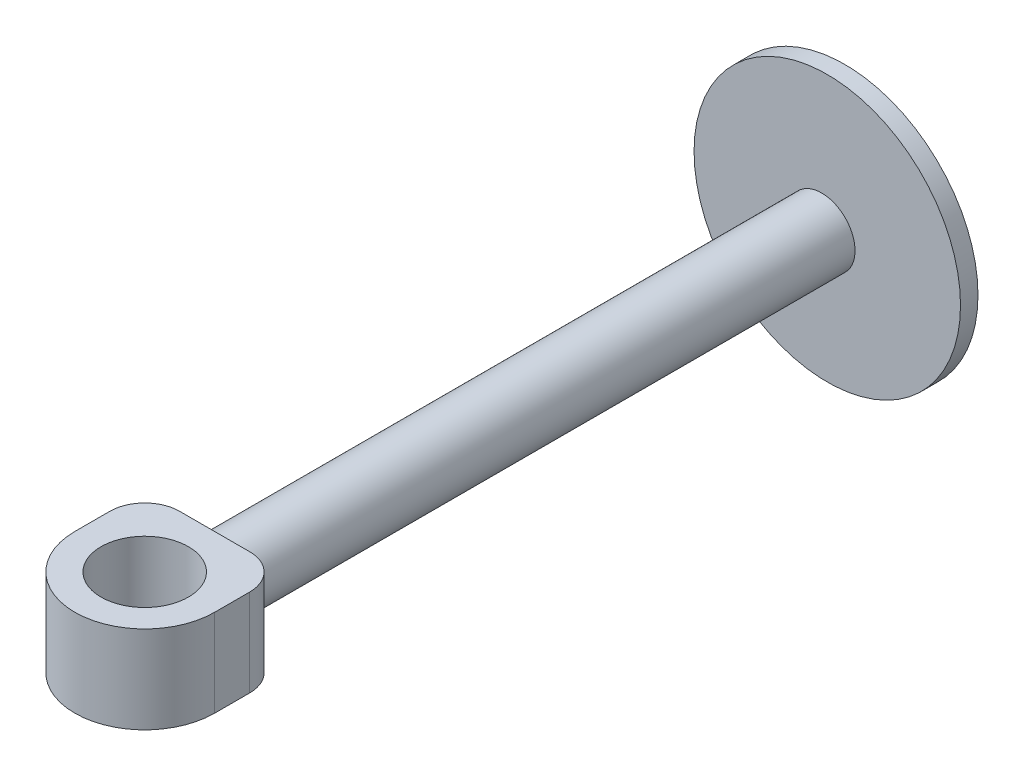
ISO-10303-21;
HEADER;
FILE_DESCRIPTION(('STEP AP214'),'2;1');
FILE_NAME('part.step','',(''),(''),'','','');
FILE_SCHEMA(('AUTOMOTIVE_DESIGN { 1 0 10303 214 1 1 1 1 }'));
ENDSEC;
DATA;
#1=APPLICATION_CONTEXT('core data for automotive mechanical design processes');
#2=APPLICATION_PROTOCOL_DEFINITION('international standard','automotive_design',2000,#1);
#3=PRODUCT_CONTEXT('',#1,'mechanical');
#4=PRODUCT('Part','Part','',(#3));
#5=PRODUCT_RELATED_PRODUCT_CATEGORY('part','',(#4));
#6=PRODUCT_DEFINITION_FORMATION('','',#4);
#7=PRODUCT_DEFINITION_CONTEXT('part definition',#1,'design');
#8=PRODUCT_DEFINITION('design','',#6,#7);
#9=PRODUCT_DEFINITION_SHAPE('','',#8);
#10=(LENGTH_UNIT() NAMED_UNIT(*) SI_UNIT(.MILLI.,.METRE.));
#11=(NAMED_UNIT(*) PLANE_ANGLE_UNIT() SI_UNIT($,.RADIAN.));
#12=(NAMED_UNIT(*) SI_UNIT($,.STERADIAN.) SOLID_ANGLE_UNIT());
#13=UNCERTAINTY_MEASURE_WITH_UNIT(LENGTH_MEASURE(1.E-05),#10,'distance_accuracy_value','');
#14=(GEOMETRIC_REPRESENTATION_CONTEXT(3) GLOBAL_UNCERTAINTY_ASSIGNED_CONTEXT((#13)) GLOBAL_UNIT_ASSIGNED_CONTEXT((#10,
#11,#12)) REPRESENTATION_CONTEXT('',''));
#15=CARTESIAN_POINT('',(0.,0.,0.));
#16=DIRECTION('',(0.,0.,1.));
#17=DIRECTION('',(1.,0.,0.));
#18=AXIS2_PLACEMENT_3D('',#15,#16,#17);
#19=CARTESIAN_POINT('',(0.,0.,-158.1766));
#20=DIRECTION('',(0.,0.,1.));
#21=DIRECTION('',(1.,0.,0.));
#22=AXIS2_PLACEMENT_3D('',#19,#20,#21);
#23=CYLINDRICAL_SURFACE('',#22,38.1);
#24=CARTESIAN_POINT('',(0.,0.,-158.1766));
#25=DIRECTION('',(0.,0.,1.));
#26=DIRECTION('',(-1.,0.,0.));
#27=AXIS2_PLACEMENT_3D('',#24,#25,#26);
#28=CIRCLE('',#27,38.1);
#29=CARTESIAN_POINT('',(-38.1,0.,-158.1766));
#30=VERTEX_POINT('',#29);
#31=EDGE_CURVE('E11',#30,#30,#28,.T.);
#32=ORIENTED_EDGE('',*,*,#31,.T.);
#33=EDGE_LOOP('',(#32));
#34=FACE_BOUND('',#33,.T.);
#35=CARTESIAN_POINT('',(0.,0.,-153.1766));
#36=DIRECTION('',(0.,0.,1.));
#37=DIRECTION('',(-1.,0.,0.));
#38=AXIS2_PLACEMENT_3D('',#35,#36,#37);
#39=CIRCLE('',#38,38.1);
#40=CARTESIAN_POINT('',(-38.1,0.,-153.1766));
#41=VERTEX_POINT('',#40);
#42=EDGE_CURVE('E50',#41,#41,#39,.T.);
#43=ORIENTED_EDGE('',*,*,#42,.F.);
#44=EDGE_LOOP('',(#43));
#45=FACE_BOUND('',#44,.T.);
#46=ADVANCED_FACE('F47',(#34,#45),#23,.T.);
#47=CARTESIAN_POINT('',(0.,0.,-158.1766));
#48=DIRECTION('',(0.,0.,-1.));
#49=DIRECTION('',(-1.,0.,0.));
#50=AXIS2_PLACEMENT_3D('',#47,#48,#49);
#51=PLANE('',#50);
#52=ORIENTED_EDGE('',*,*,#31,.F.);
#53=EDGE_LOOP('',(#52));
#54=FACE_BOUND('',#53,.T.);
#55=ADVANCED_FACE('F62',(#54),#51,.T.);
#56=CARTESIAN_POINT('',(0.,0.,-153.1766));
#57=DIRECTION('',(0.,0.,-1.));
#58=DIRECTION('',(-1.,0.,0.));
#59=AXIS2_PLACEMENT_3D('',#56,#57,#58);
#60=PLANE('',#59);
#61=ORIENTED_EDGE('',*,*,#42,.T.);
#62=EDGE_LOOP('',(#61));
#63=FACE_BOUND('',#62,.T.);
#64=ADVANCED_FACE('F59',(#63),#60,.F.);
#65=CLOSED_SHELL('',(#46,#55,#64));
#66=MANIFOLD_SOLID_BREP('B2',#65);
#67=CARTESIAN_POINT('',(0.,-12.5,42.0218));
#68=DIRECTION('',(0.,-1.,0.));
#69=DIRECTION('',(0.,0.,-1.));
#70=AXIS2_PLACEMENT_3D('',#67,#68,#69);
#71=CYLINDRICAL_SURFACE('',#70,20.);
#72=DIRECTION('',(0.,-1.,0.));
#73=VECTOR('',#72,1.);
#74=CARTESIAN_POINT('',(-20.,-12.5,42.0218));
#75=LINE('',#74,#73);
#76=CARTESIAN_POINT('',(-20.,-12.5,42.0218));
#77=VERTEX_POINT('',#76);
#78=CARTESIAN_POINT('',(-20.,12.5,42.0218));
#79=VERTEX_POINT('',#78);
#80=EDGE_CURVE('E157',#77,#79,#75,.F.);
#81=ORIENTED_EDGE('',*,*,#80,.F.);
#82=CARTESIAN_POINT('',(0.,-12.5,42.0218));
#83=DIRECTION('',(0.,1.,0.));
#84=DIRECTION('',(0.,0.,1.));
#85=AXIS2_PLACEMENT_3D('',#82,#83,#84);
#86=CIRCLE('',#85,20.);
#87=CARTESIAN_POINT('',(20.,-12.5,42.0218));
#88=VERTEX_POINT('',#87);
#89=EDGE_CURVE('E143',#88,#77,#86,.F.);
#90=ORIENTED_EDGE('',*,*,#89,.F.);
#91=DIRECTION('',(0.,-1.,0.));
#92=VECTOR('',#91,1.);
#93=CARTESIAN_POINT('',(20.,-12.5,42.0218));
#94=LINE('',#93,#92);
#95=CARTESIAN_POINT('',(20.,12.5,42.0218));
#96=VERTEX_POINT('',#95);
#97=EDGE_CURVE('E154',#96,#88,#94,.T.);
#98=ORIENTED_EDGE('',*,*,#97,.F.);
#99=CARTESIAN_POINT('',(0.,12.5,42.0218));
#100=DIRECTION('',(0.,-1.,0.));
#101=DIRECTION('',(0.,0.,-1.));
#102=AXIS2_PLACEMENT_3D('',#99,#100,#101);
#103=CIRCLE('',#102,20.);
#104=EDGE_CURVE('E153',#79,#96,#103,.F.);
#105=ORIENTED_EDGE('',*,*,#104,.F.);
#106=EDGE_LOOP('',(#81,#90,#98,#105));
#107=FACE_BOUND('',#106,.T.);
#108=ADVANCED_FACE('F88',(#107),#71,.T.);
#109=CARTESIAN_POINT('',(0.,0.,22.0218));
#110=DIRECTION('',(0.,0.,-1.));
#111=DIRECTION('',(-1.,0.,0.));
#112=AXIS2_PLACEMENT_3D('',#109,#110,#111);
#113=PLANE('',#112);
#114=DIRECTION('',(-1.,0.,0.));
#115=VECTOR('',#114,1.);
#116=CARTESIAN_POINT('',(-20.,12.5,22.0218));
#117=LINE('',#116,#115);
#118=CARTESIAN_POINT('',(10.,12.5,22.0218));
#119=VERTEX_POINT('',#118);
#120=CARTESIAN_POINT('',(-10.,12.5,22.0218));
#121=VERTEX_POINT('',#120);
#122=EDGE_CURVE('E201',#119,#121,#117,.T.);
#123=ORIENTED_EDGE('',*,*,#122,.F.);
#124=DIRECTION('',(0.,1.,0.));
#125=VECTOR('',#124,1.);
#126=CARTESIAN_POINT('',(10.,-12.5,22.0218));
#127=LINE('',#126,#125);
#128=CARTESIAN_POINT('',(10.,-12.5,22.0218));
#129=VERTEX_POINT('',#128);
#130=EDGE_CURVE('E110',#119,#129,#127,.F.);
#131=ORIENTED_EDGE('',*,*,#130,.T.);
#132=DIRECTION('',(1.,0.,0.));
#133=VECTOR('',#132,1.);
#134=CARTESIAN_POINT('',(-20.,-12.5,22.0218));
#135=LINE('',#134,#133);
#136=CARTESIAN_POINT('',(-10.,-12.5,22.0218));
#137=VERTEX_POINT('',#136);
#138=EDGE_CURVE('E168',#137,#129,#135,.T.);
#139=ORIENTED_EDGE('',*,*,#138,.F.);
#140=DIRECTION('',(0.,-1.,0.));
#141=VECTOR('',#140,1.);
#142=CARTESIAN_POINT('',(-10.,12.5,22.0218));
#143=LINE('',#142,#141);
#144=EDGE_CURVE('E188',#137,#121,#143,.F.);
#145=ORIENTED_EDGE('',*,*,#144,.T.);
#146=EDGE_LOOP('',(#123,#131,#139,#145));
#147=FACE_BOUND('',#146,.T.);
#148=CARTESIAN_POINT('',(0.,0.,22.0218));
#149=DIRECTION('',(0.,0.,-1.));
#150=DIRECTION('',(-1.,0.,0.));
#151=AXIS2_PLACEMENT_3D('',#148,#149,#150);
#152=CIRCLE('',#151,9.525);
#153=CARTESIAN_POINT('',(-9.525,0.,22.0218));
#154=VERTEX_POINT('',#153);
#155=EDGE_CURVE('E174',#154,#154,#152,.T.);
#156=ORIENTED_EDGE('',*,*,#155,.F.);
#157=EDGE_LOOP('',(#156));
#158=FACE_BOUND('',#157,.T.);
#159=ADVANCED_FACE('F203',(#147,#158),#113,.T.);
#160=CARTESIAN_POINT('',(20.,-12.5,62.0218));
#161=DIRECTION('',(-1.,0.,0.));
#162=DIRECTION('',(0.,0.,1.));
#163=AXIS2_PLACEMENT_3D('',#160,#161,#162);
#164=PLANE('',#163);
#165=DIRECTION('',(0.,0.,-1.));
#166=VECTOR('',#165,1.);
#167=CARTESIAN_POINT('',(20.,-12.5,62.0218));
#168=LINE('',#167,#166);
#169=CARTESIAN_POINT('',(20.,-12.5,32.0218));
#170=VERTEX_POINT('',#169);
#171=EDGE_CURVE('E149',#88,#170,#168,.T.);
#172=ORIENTED_EDGE('',*,*,#171,.T.);
#173=DIRECTION('',(0.,1.,0.));
#174=VECTOR('',#173,1.);
#175=CARTESIAN_POINT('',(20.,12.5,32.0218));
#176=LINE('',#175,#174);
#177=CARTESIAN_POINT('',(20.,12.5,32.0218));
#178=VERTEX_POINT('',#177);
#179=EDGE_CURVE('E181',#170,#178,#176,.T.);
#180=ORIENTED_EDGE('',*,*,#179,.T.);
#181=DIRECTION('',(0.,0.,-1.));
#182=VECTOR('',#181,1.);
#183=CARTESIAN_POINT('',(20.,12.5,62.0218));
#184=LINE('',#183,#182);
#185=EDGE_CURVE('E166',#96,#178,#184,.T.);
#186=ORIENTED_EDGE('',*,*,#185,.F.);
#187=ORIENTED_EDGE('',*,*,#97,.T.);
#188=EDGE_LOOP('',(#172,#180,#186,#187));
#189=FACE_BOUND('',#188,.T.);
#190=ADVANCED_FACE('F195',(#189),#164,.F.);
#191=CARTESIAN_POINT('',(-20.,12.5,62.0218));
#192=DIRECTION('',(0.,-1.,0.));
#193=DIRECTION('',(0.,0.,-1.));
#194=AXIS2_PLACEMENT_3D('',#191,#192,#193);
#195=PLANE('',#194);
#196=CARTESIAN_POINT('',(0.,12.5,42.0218));
#197=DIRECTION('',(0.,1.,0.));
#198=DIRECTION('',(0.,0.,1.));
#199=AXIS2_PLACEMENT_3D('',#196,#197,#198);
#200=CIRCLE('',#199,12.5);
#201=CARTESIAN_POINT('',(0.,12.5,54.5218));
#202=VERTEX_POINT('',#201);
#203=EDGE_CURVE('E208',#202,#202,#200,.T.);
#204=ORIENTED_EDGE('',*,*,#203,.F.);
#205=EDGE_LOOP('',(#204));
#206=FACE_BOUND('',#205,.T.);
#207=ORIENTED_EDGE('',*,*,#185,.T.);
#208=CARTESIAN_POINT('',(10.,12.5,32.0218));
#209=DIRECTION('',(0.,-1.,0.));
#210=DIRECTION('',(0.,0.,-1.));
#211=AXIS2_PLACEMENT_3D('',#208,#209,#210);
#212=CIRCLE('',#211,10.);
#213=EDGE_CURVE('E186',#178,#119,#212,.F.);
#214=ORIENTED_EDGE('',*,*,#213,.T.);
#215=ORIENTED_EDGE('',*,*,#122,.T.);
#216=CARTESIAN_POINT('',(-10.,12.5,32.0218));
#217=DIRECTION('',(0.,-1.,0.));
#218=DIRECTION('',(0.,0.,-1.));
#219=AXIS2_PLACEMENT_3D('',#216,#217,#218);
#220=CIRCLE('',#219,10.);
#221=CARTESIAN_POINT('',(-20.,12.5,32.0218));
#222=VERTEX_POINT('',#221);
#223=EDGE_CURVE('E184',#121,#222,#220,.F.);
#224=ORIENTED_EDGE('',*,*,#223,.T.);
#225=DIRECTION('',(0.,0.,-1.));
#226=VECTOR('',#225,1.);
#227=CARTESIAN_POINT('',(-20.,12.5,62.0218));
#228=LINE('',#227,#226);
#229=EDGE_CURVE('E164',#79,#222,#228,.T.);
#230=ORIENTED_EDGE('',*,*,#229,.F.);
#231=ORIENTED_EDGE('',*,*,#104,.T.);
#232=EDGE_LOOP('',(#207,#214,#215,#224,#230,#231));
#233=FACE_BOUND('',#232,.T.);
#234=ADVANCED_FACE('F200',(#206,#233),#195,.F.);
#235=CARTESIAN_POINT('',(-20.,-12.5,62.0218));
#236=DIRECTION('',(1.,0.,0.));
#237=DIRECTION('',(0.,0.,-1.));
#238=AXIS2_PLACEMENT_3D('',#235,#236,#237);
#239=PLANE('',#238);
#240=ORIENTED_EDGE('',*,*,#229,.T.);
#241=DIRECTION('',(0.,-1.,0.));
#242=VECTOR('',#241,1.);
#243=CARTESIAN_POINT('',(-20.,-12.5,32.0218));
#244=LINE('',#243,#242);
#245=CARTESIAN_POINT('',(-20.,-12.5,32.0218));
#246=VERTEX_POINT('',#245);
#247=EDGE_CURVE('E45',#222,#246,#244,.T.);
#248=ORIENTED_EDGE('',*,*,#247,.T.);
#249=DIRECTION('',(0.,0.,-1.));
#250=VECTOR('',#249,1.);
#251=CARTESIAN_POINT('',(-20.,-12.5,62.0218));
#252=LINE('',#251,#250);
#253=EDGE_CURVE('E147',#77,#246,#252,.T.);
#254=ORIENTED_EDGE('',*,*,#253,.F.);
#255=ORIENTED_EDGE('',*,*,#80,.T.);
#256=EDGE_LOOP('',(#240,#248,#254,#255));
#257=FACE_BOUND('',#256,.T.);
#258=ADVANCED_FACE('F163',(#257),#239,.F.);
#259=CARTESIAN_POINT('',(-20.,-12.5,62.0218));
#260=DIRECTION('',(0.,1.,0.));
#261=DIRECTION('',(0.,0.,1.));
#262=AXIS2_PLACEMENT_3D('',#259,#260,#261);
#263=PLANE('',#262);
#264=CARTESIAN_POINT('',(0.,-12.5,42.0218));
#265=DIRECTION('',(0.,1.,0.));
#266=DIRECTION('',(0.,0.,1.));
#267=AXIS2_PLACEMENT_3D('',#264,#265,#266);
#268=CIRCLE('',#267,12.5);
#269=CARTESIAN_POINT('',(0.,-12.5,54.5218));
#270=VERTEX_POINT('',#269);
#271=EDGE_CURVE('E205',#270,#270,#268,.F.);
#272=ORIENTED_EDGE('',*,*,#271,.F.);
#273=EDGE_LOOP('',(#272));
#274=FACE_BOUND('',#273,.T.);
#275=ORIENTED_EDGE('',*,*,#138,.T.);
#276=CARTESIAN_POINT('',(10.,-12.5,32.0218));
#277=DIRECTION('',(0.,1.,0.));
#278=DIRECTION('',(0.,0.,1.));
#279=AXIS2_PLACEMENT_3D('',#276,#277,#278);
#280=CIRCLE('',#279,10.);
#281=EDGE_CURVE('E96',#129,#170,#280,.F.);
#282=ORIENTED_EDGE('',*,*,#281,.T.);
#283=ORIENTED_EDGE('',*,*,#171,.F.);
#284=ORIENTED_EDGE('',*,*,#89,.T.);
#285=ORIENTED_EDGE('',*,*,#253,.T.);
#286=CARTESIAN_POINT('',(-10.,-12.5,32.0218));
#287=DIRECTION('',(0.,1.,0.));
#288=DIRECTION('',(0.,0.,1.));
#289=AXIS2_PLACEMENT_3D('',#286,#287,#288);
#290=CIRCLE('',#289,10.);
#291=EDGE_CURVE('E103',#246,#137,#290,.F.);
#292=ORIENTED_EDGE('',*,*,#291,.T.);
#293=EDGE_LOOP('',(#275,#282,#283,#284,#285,#292));
#294=FACE_BOUND('',#293,.T.);
#295=ADVANCED_FACE('F145',(#274,#294),#263,.F.);
#296=CARTESIAN_POINT('',(0.,0.,22.0218));
#297=DIRECTION('',(0.,0.,1.));
#298=DIRECTION('',(1.,0.,0.));
#299=AXIS2_PLACEMENT_3D('',#296,#297,#298);
#300=CYLINDRICAL_SURFACE('',#299,9.525);
#301=ORIENTED_EDGE('',*,*,#155,.T.);
#302=EDGE_LOOP('',(#301));
#303=FACE_BOUND('',#302,.T.);
#304=CARTESIAN_POINT('',(0.,0.,-151.5891));
#305=DIRECTION('',(0.,0.,-1.));
#306=DIRECTION('',(-1.,0.,0.));
#307=AXIS2_PLACEMENT_3D('',#304,#305,#306);
#308=CIRCLE('',#307,9.525);
#309=CARTESIAN_POINT('',(-9.52499999999999,0.,-151.5891));
#310=VERTEX_POINT('',#309);
#311=EDGE_CURVE('E161',#310,#310,#308,.T.);
#312=ORIENTED_EDGE('',*,*,#311,.F.);
#313=EDGE_LOOP('',(#312));
#314=FACE_BOUND('',#313,.T.);
#315=ADVANCED_FACE('F235',(#303,#314),#300,.T.);
#316=CARTESIAN_POINT('',(0.,0.,-151.5891));
#317=DIRECTION('',(0.,0.,-1.));
#318=DIRECTION('',(-1.,0.,0.));
#319=AXIS2_PLACEMENT_3D('',#316,#317,#318);
#320=PLANE('',#319);
#321=ORIENTED_EDGE('',*,*,#311,.T.);
#322=EDGE_LOOP('',(#321));
#323=FACE_BOUND('',#322,.T.);
#324=ADVANCED_FACE('F238',(#323),#320,.T.);
#325=CARTESIAN_POINT('',(10.,-12.5,32.0218));
#326=DIRECTION('',(0.,-1.,0.));
#327=DIRECTION('',(0.,0.,-1.));
#328=AXIS2_PLACEMENT_3D('',#325,#326,#327);
#329=CYLINDRICAL_SURFACE('',#328,10.);
#330=ORIENTED_EDGE('',*,*,#281,.F.);
#331=ORIENTED_EDGE('',*,*,#130,.F.);
#332=ORIENTED_EDGE('',*,*,#213,.F.);
#333=ORIENTED_EDGE('',*,*,#179,.F.);
#334=EDGE_LOOP('',(#330,#331,#332,#333));
#335=FACE_BOUND('',#334,.T.);
#336=ADVANCED_FACE('F197',(#335),#329,.T.);
#337=CARTESIAN_POINT('',(-10.,-12.5,32.0218));
#338=DIRECTION('',(0.,1.,0.));
#339=DIRECTION('',(0.,0.,1.));
#340=AXIS2_PLACEMENT_3D('',#337,#338,#339);
#341=CYLINDRICAL_SURFACE('',#340,10.);
#342=ORIENTED_EDGE('',*,*,#223,.F.);
#343=ORIENTED_EDGE('',*,*,#144,.F.);
#344=ORIENTED_EDGE('',*,*,#291,.F.);
#345=ORIENTED_EDGE('',*,*,#247,.F.);
#346=EDGE_LOOP('',(#342,#343,#344,#345));
#347=FACE_BOUND('',#346,.T.);
#348=ADVANCED_FACE('F90',(#347),#341,.T.);
#349=CARTESIAN_POINT('',(0.,-38.101,42.0218));
#350=DIRECTION('',(0.,1.,0.));
#351=DIRECTION('',(0.,0.,1.));
#352=AXIS2_PLACEMENT_3D('',#349,#350,#351);
#353=CYLINDRICAL_SURFACE('',#352,12.5);
#354=CARTESIAN_POINT('',(0.,12.5,54.5218));
#355=CARTESIAN_POINT('',(0.,12.2395833333333,54.5218));
#356=CARTESIAN_POINT('',(0.,11.9791666666667,54.5218));
#357=CARTESIAN_POINT('',(0.,11.4583333333333,54.5218));
#358=CARTESIAN_POINT('',(0.,11.1979166666667,54.5218));
#359=CARTESIAN_POINT('',(0.,10.6770833333333,54.5218));
#360=CARTESIAN_POINT('',(0.,10.4166666666667,54.5218));
#361=CARTESIAN_POINT('',(0.,9.89583333333334,54.5218));
#362=CARTESIAN_POINT('',(0.,9.63541666666667,54.5218));
#363=CARTESIAN_POINT('',(0.,9.11458333333334,54.5218));
#364=CARTESIAN_POINT('',(0.,8.85416666666667,54.5218));
#365=CARTESIAN_POINT('',(0.,8.33333333333334,54.5218));
#366=CARTESIAN_POINT('',(0.,8.07291666666667,54.5218));
#367=CARTESIAN_POINT('',(0.,7.55208333333333,54.5218));
#368=CARTESIAN_POINT('',(0.,7.29166666666667,54.5218));
#369=CARTESIAN_POINT('',(0.,6.77083333333333,54.5218));
#370=CARTESIAN_POINT('',(0.,6.51041666666667,54.5218));
#371=CARTESIAN_POINT('',(0.,5.98958333333333,54.5218));
#372=CARTESIAN_POINT('',(0.,5.72916666666667,54.5218));
#373=CARTESIAN_POINT('',(0.,5.20833333333334,54.5218));
#374=CARTESIAN_POINT('',(0.,4.94791666666667,54.5218));
#375=CARTESIAN_POINT('',(0.,4.42708333333334,54.5218));
#376=CARTESIAN_POINT('',(0.,4.16666666666667,54.5218));
#377=CARTESIAN_POINT('',(0.,3.64583333333333,54.5218));
#378=CARTESIAN_POINT('',(0.,3.38541666666667,54.5218));
#379=CARTESIAN_POINT('',(0.,2.86458333333333,54.5218));
#380=CARTESIAN_POINT('',(0.,2.60416666666667,54.5218));
#381=CARTESIAN_POINT('',(0.,2.08333333333333,54.5218));
#382=CARTESIAN_POINT('',(0.,1.82291666666667,54.5218));
#383=CARTESIAN_POINT('',(0.,1.30208333333334,54.5218));
#384=CARTESIAN_POINT('',(0.,1.04166666666667,54.5218));
#385=CARTESIAN_POINT('',(0.,0.520833333333336,54.5218));
#386=CARTESIAN_POINT('',(0.,0.260416666666668,54.5218));
#387=CARTESIAN_POINT('',(0.,-0.260416666666668,54.5218));
#388=CARTESIAN_POINT('',(0.,-0.520833333333336,54.5218));
#389=CARTESIAN_POINT('',(0.,-1.04166666666667,54.5218));
#390=CARTESIAN_POINT('',(0.,-1.30208333333334,54.5218));
#391=CARTESIAN_POINT('',(0.,-1.82291666666667,54.5218));
#392=CARTESIAN_POINT('',(0.,-2.08333333333333,54.5218));
#393=CARTESIAN_POINT('',(0.,-2.60416666666667,54.5218));
#394=CARTESIAN_POINT('',(0.,-2.86458333333333,54.5218));
#395=CARTESIAN_POINT('',(0.,-3.38541666666667,54.5218));
#396=CARTESIAN_POINT('',(0.,-3.64583333333333,54.5218));
#397=CARTESIAN_POINT('',(0.,-4.16666666666667,54.5218));
#398=CARTESIAN_POINT('',(0.,-4.42708333333334,54.5218));
#399=CARTESIAN_POINT('',(0.,-4.94791666666667,54.5218));
#400=CARTESIAN_POINT('',(0.,-5.20833333333334,54.5218));
#401=CARTESIAN_POINT('',(0.,-5.72916666666667,54.5218));
#402=CARTESIAN_POINT('',(0.,-5.98958333333333,54.5218));
#403=CARTESIAN_POINT('',(0.,-6.51041666666667,54.5218));
#404=CARTESIAN_POINT('',(0.,-6.77083333333333,54.5218));
#405=CARTESIAN_POINT('',(0.,-7.29166666666667,54.5218));
#406=CARTESIAN_POINT('',(0.,-7.55208333333333,54.5218));
#407=CARTESIAN_POINT('',(0.,-8.07291666666667,54.5218));
#408=CARTESIAN_POINT('',(0.,-8.33333333333333,54.5218));
#409=CARTESIAN_POINT('',(0.,-8.85416666666667,54.5218));
#410=CARTESIAN_POINT('',(0.,-9.11458333333333,54.5218));
#411=CARTESIAN_POINT('',(0.,-9.63541666666667,54.5218));
#412=CARTESIAN_POINT('',(0.,-9.89583333333333,54.5218));
#413=CARTESIAN_POINT('',(0.,-10.4166666666667,54.5218));
#414=CARTESIAN_POINT('',(0.,-10.6770833333333,54.5218));
#415=CARTESIAN_POINT('',(0.,-11.1979166666667,54.5218));
#416=CARTESIAN_POINT('',(0.,-11.4583333333333,54.5218));
#417=CARTESIAN_POINT('',(0.,-11.9791666666667,54.5218));
#418=CARTESIAN_POINT('',(0.,-12.2395833333333,54.5218));
#419=CARTESIAN_POINT('',(0.,-12.5,54.5218));
#420=B_SPLINE_CURVE_WITH_KNOTS('',3,(#354,#355,#356,#357,#358,#359,#360,#361,#362,#363,#364,
#365,#366,#367,#368,#369,#370,#371,#372,#373,#374,#375,#376,#377,#378,#379,#380,#381,#382,#383,
#384,#385,#386,#387,#388,#389,#390,#391,#392,#393,#394,#395,#396,#397,#398,#399,#400,#401,#402,
#403,#404,#405,#406,#407,#408,#409,#410,#411,#412,#413,#414,#415,#416,#417,#418,#419),
.UNSPECIFIED.,.F.,.F.,(4,2,2,2,2,2,2,2,2,2,2,2,2,2,2,2,2,2,2,2,2,2,2,2,2,2,2,2,2,2,2,2,4),(0.,
0.781249999999997,1.5625,2.34375,3.125,3.90625,4.6875,5.46875,6.25000000000001,7.03125,7.8125,
8.59375,9.375,10.15625,10.9375,11.71875,12.5,13.28125,14.0625,14.84375,15.625,16.40625,17.1875,
17.96875,18.75,19.53125,20.3125,21.09375,21.875,22.65625,23.4375,24.21875,25.),.UNSPECIFIED.);
#421=EDGE_CURVE('BSEAM214',#202,#270,#420,.T.);
#422=ORIENTED_EDGE('',*,*,#203,.T.);
#423=ORIENTED_EDGE('',*,*,#271,.T.);
#424=ORIENTED_EDGE('',*,*,#421,.T.);
#425=ORIENTED_EDGE('',*,*,#421,.F.);
#426=EDGE_LOOP('',(#422,#424,#423,#425));
#427=FACE_BOUND('',#426,.T.);
#428=ADVANCED_FACE('F214',(#427),#353,.F.);
#429=CLOSED_SHELL('',(#108,#159,#190,#234,#258,#295,#315,#324,#336,#348,#428));
#430=MANIFOLD_SOLID_BREP('B6',#429);
#431=ADVANCED_BREP_SHAPE_REPRESENTATION('',(#18,#66,#430),#14);
#432=SHAPE_DEFINITION_REPRESENTATION(#9,#431);
ENDSEC;
END-ISO-10303-21;
